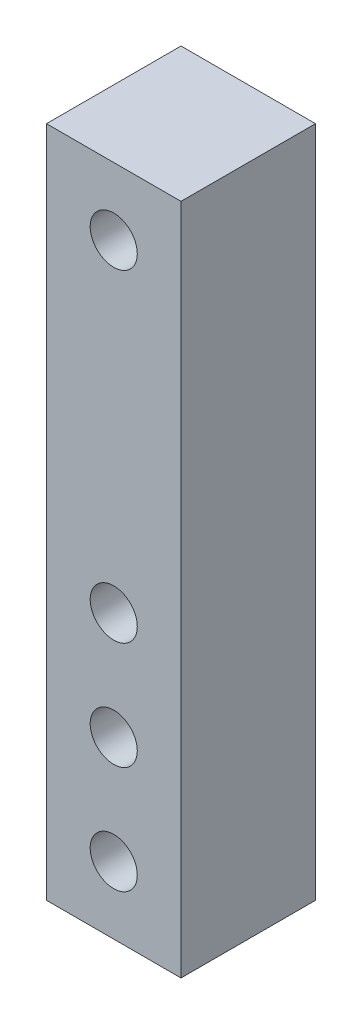
ISO-10303-21;
HEADER;
FILE_DESCRIPTION(('STEP AP214'),'2;1');
FILE_NAME('part.step','',(''),(''),'','','');
FILE_SCHEMA(('AUTOMOTIVE_DESIGN { 1 0 10303 214 1 1 1 1 }'));
ENDSEC;
DATA;
#1=APPLICATION_CONTEXT('core data for automotive mechanical design processes');
#2=APPLICATION_PROTOCOL_DEFINITION('international standard','automotive_design',2000,#1);
#3=PRODUCT_CONTEXT('',#1,'mechanical');
#4=PRODUCT('Part','Part','',(#3));
#5=PRODUCT_RELATED_PRODUCT_CATEGORY('part','',(#4));
#6=PRODUCT_DEFINITION_FORMATION('','',#4);
#7=PRODUCT_DEFINITION_CONTEXT('part definition',#1,'design');
#8=PRODUCT_DEFINITION('design','',#6,#7);
#9=PRODUCT_DEFINITION_SHAPE('','',#8);
#10=(LENGTH_UNIT() NAMED_UNIT(*) SI_UNIT(.MILLI.,.METRE.));
#11=(NAMED_UNIT(*) PLANE_ANGLE_UNIT() SI_UNIT($,.RADIAN.));
#12=(NAMED_UNIT(*) SI_UNIT($,.STERADIAN.) SOLID_ANGLE_UNIT());
#13=UNCERTAINTY_MEASURE_WITH_UNIT(LENGTH_MEASURE(1.E-05),#10,'distance_accuracy_value','');
#14=(GEOMETRIC_REPRESENTATION_CONTEXT(3) GLOBAL_UNCERTAINTY_ASSIGNED_CONTEXT((#13)) GLOBAL_UNIT_ASSIGNED_CONTEXT((#10,
#11,#12)) REPRESENTATION_CONTEXT('',''));
#15=CARTESIAN_POINT('',(0.,0.,0.));
#16=DIRECTION('',(0.,0.,1.));
#17=DIRECTION('',(1.,0.,0.));
#18=AXIS2_PLACEMENT_3D('',#15,#16,#17);
#19=CARTESIAN_POINT('',(0.,0.,10.));
#20=DIRECTION('',(0.,0.,1.));
#21=DIRECTION('',(1.,0.,0.));
#22=AXIS2_PLACEMENT_3D('',#19,#20,#21);
#23=PLANE('',#22);
#24=CARTESIAN_POINT('',(0.,-4.,10.));
#25=DIRECTION('',(0.,0.,1.));
#26=DIRECTION('',(1.,0.,0.));
#27=AXIS2_PLACEMENT_3D('',#24,#25,#26);
#28=CIRCLE('',#27,1.75);
#29=CARTESIAN_POINT('',(1.75,-4.,10.));
#30=VERTEX_POINT('',#29);
#31=EDGE_CURVE('E146',#30,#30,#28,.T.);
#32=ORIENTED_EDGE('',*,*,#31,.F.);
#33=EDGE_LOOP('',(#32));
#34=FACE_BOUND('',#33,.T.);
#35=CARTESIAN_POINT('',(0.,-20.,10.));
#36=DIRECTION('',(0.,0.,1.));
#37=DIRECTION('',(1.,0.,0.));
#38=AXIS2_PLACEMENT_3D('',#35,#36,#37);
#39=CIRCLE('',#38,1.75);
#40=CARTESIAN_POINT('',(1.75000000000001,-20.,10.));
#41=VERTEX_POINT('',#40);
#42=EDGE_CURVE('E116',#41,#41,#39,.T.);
#43=ORIENTED_EDGE('',*,*,#42,.F.);
#44=EDGE_LOOP('',(#43));
#45=FACE_BOUND('',#44,.T.);
#46=DIRECTION('',(0.,1.,0.));
#47=VECTOR('',#46,1.);
#48=CARTESIAN_POINT('',(5.,25.,10.));
#49=LINE('',#48,#47);
#50=CARTESIAN_POINT('',(5.,-25.,10.));
#51=VERTEX_POINT('',#50);
#52=CARTESIAN_POINT('',(5.,25.,10.));
#53=VERTEX_POINT('',#52);
#54=EDGE_CURVE('E96',#51,#53,#49,.T.);
#55=ORIENTED_EDGE('',*,*,#54,.T.);
#56=DIRECTION('',(-1.,0.,0.));
#57=VECTOR('',#56,1.);
#58=CARTESIAN_POINT('',(-5.,25.,10.));
#59=LINE('',#58,#57);
#60=CARTESIAN_POINT('',(-5.,25.,10.));
#61=VERTEX_POINT('',#60);
#62=EDGE_CURVE('E91',#53,#61,#59,.T.);
#63=ORIENTED_EDGE('',*,*,#62,.T.);
#64=DIRECTION('',(0.,-1.,0.));
#65=VECTOR('',#64,1.);
#66=CARTESIAN_POINT('',(-5.,25.,10.));
#67=LINE('',#66,#65);
#68=CARTESIAN_POINT('',(-5.,-25.,10.));
#69=VERTEX_POINT('',#68);
#70=EDGE_CURVE('E94',#61,#69,#67,.T.);
#71=ORIENTED_EDGE('',*,*,#70,.T.);
#72=DIRECTION('',(1.,0.,0.));
#73=VECTOR('',#72,1.);
#74=CARTESIAN_POINT('',(-5.,-25.,10.));
#75=LINE('',#74,#73);
#76=EDGE_CURVE('E61',#69,#51,#75,.T.);
#77=ORIENTED_EDGE('',*,*,#76,.T.);
#78=EDGE_LOOP('',(#55,#63,#71,#77));
#79=FACE_BOUND('',#78,.T.);
#80=CARTESIAN_POINT('',(0.,-12.,10.));
#81=DIRECTION('',(0.,0.,1.));
#82=DIRECTION('',(1.,0.,0.));
#83=AXIS2_PLACEMENT_3D('',#80,#81,#82);
#84=CIRCLE('',#83,1.75);
#85=CARTESIAN_POINT('',(1.75,-12.,10.));
#86=VERTEX_POINT('',#85);
#87=EDGE_CURVE('E138',#86,#86,#84,.T.);
#88=ORIENTED_EDGE('',*,*,#87,.F.);
#89=EDGE_LOOP('',(#88));
#90=FACE_BOUND('',#89,.T.);
#91=CARTESIAN_POINT('',(0.,20.,10.));
#92=DIRECTION('',(0.,0.,1.));
#93=DIRECTION('',(1.,0.,0.));
#94=AXIS2_PLACEMENT_3D('',#91,#92,#93);
#95=CIRCLE('',#94,1.75);
#96=CARTESIAN_POINT('',(1.75,20.,10.));
#97=VERTEX_POINT('',#96);
#98=EDGE_CURVE('E154',#97,#97,#95,.T.);
#99=ORIENTED_EDGE('',*,*,#98,.F.);
#100=EDGE_LOOP('',(#99));
#101=FACE_BOUND('',#100,.T.);
#102=ADVANCED_FACE('F43',(#34,#45,#79,#90,#101),#23,.T.);
#103=CARTESIAN_POINT('',(0.,0.,0.));
#104=DIRECTION('',(0.,0.,1.));
#105=DIRECTION('',(1.,0.,0.));
#106=AXIS2_PLACEMENT_3D('',#103,#104,#105);
#107=PLANE('',#106);
#108=DIRECTION('',(0.,1.,0.));
#109=VECTOR('',#108,1.);
#110=CARTESIAN_POINT('',(5.,25.,0.));
#111=LINE('',#110,#109);
#112=CARTESIAN_POINT('',(5.,-25.,0.));
#113=VERTEX_POINT('',#112);
#114=CARTESIAN_POINT('',(5.,25.,0.));
#115=VERTEX_POINT('',#114);
#116=EDGE_CURVE('E112',#113,#115,#111,.T.);
#117=ORIENTED_EDGE('',*,*,#116,.F.);
#118=DIRECTION('',(1.,0.,0.));
#119=VECTOR('',#118,1.);
#120=CARTESIAN_POINT('',(-5.,-25.,0.));
#121=LINE('',#120,#119);
#122=CARTESIAN_POINT('',(-5.,-25.,0.));
#123=VERTEX_POINT('',#122);
#124=EDGE_CURVE('E84',#123,#113,#121,.T.);
#125=ORIENTED_EDGE('',*,*,#124,.F.);
#126=DIRECTION('',(0.,-1.,0.));
#127=VECTOR('',#126,1.);
#128=CARTESIAN_POINT('',(-5.,25.,0.));
#129=LINE('',#128,#127);
#130=CARTESIAN_POINT('',(-5.,25.,0.));
#131=VERTEX_POINT('',#130);
#132=EDGE_CURVE('E78',#131,#123,#129,.T.);
#133=ORIENTED_EDGE('',*,*,#132,.F.);
#134=DIRECTION('',(-1.,0.,0.));
#135=VECTOR('',#134,1.);
#136=CARTESIAN_POINT('',(-5.,25.,0.));
#137=LINE('',#136,#135);
#138=EDGE_CURVE('E101',#115,#131,#137,.T.);
#139=ORIENTED_EDGE('',*,*,#138,.F.);
#140=EDGE_LOOP('',(#117,#125,#133,#139));
#141=FACE_BOUND('',#140,.T.);
#142=CARTESIAN_POINT('',(0.,-20.,0.));
#143=DIRECTION('',(0.,0.,1.));
#144=DIRECTION('',(1.,0.,0.));
#145=AXIS2_PLACEMENT_3D('',#142,#143,#144);
#146=CIRCLE('',#145,1.75);
#147=CARTESIAN_POINT('',(1.75000000000001,-20.,0.));
#148=VERTEX_POINT('',#147);
#149=EDGE_CURVE('E134',#148,#148,#146,.T.);
#150=ORIENTED_EDGE('',*,*,#149,.T.);
#151=EDGE_LOOP('',(#150));
#152=FACE_BOUND('',#151,.T.);
#153=CARTESIAN_POINT('',(0.,-12.,0.));
#154=DIRECTION('',(0.,0.,1.));
#155=DIRECTION('',(1.,0.,0.));
#156=AXIS2_PLACEMENT_3D('',#153,#154,#155);
#157=CIRCLE('',#156,1.75);
#158=CARTESIAN_POINT('',(1.75,-12.,0.));
#159=VERTEX_POINT('',#158);
#160=EDGE_CURVE('E142',#159,#159,#157,.T.);
#161=ORIENTED_EDGE('',*,*,#160,.T.);
#162=EDGE_LOOP('',(#161));
#163=FACE_BOUND('',#162,.T.);
#164=CARTESIAN_POINT('',(0.,-4.,0.));
#165=DIRECTION('',(0.,0.,1.));
#166=DIRECTION('',(1.,0.,0.));
#167=AXIS2_PLACEMENT_3D('',#164,#165,#166);
#168=CIRCLE('',#167,1.75);
#169=CARTESIAN_POINT('',(1.75,-4.,0.));
#170=VERTEX_POINT('',#169);
#171=EDGE_CURVE('E150',#170,#170,#168,.T.);
#172=ORIENTED_EDGE('',*,*,#171,.T.);
#173=EDGE_LOOP('',(#172));
#174=FACE_BOUND('',#173,.T.);
#175=CARTESIAN_POINT('',(0.,20.,0.));
#176=DIRECTION('',(0.,0.,1.));
#177=DIRECTION('',(1.,0.,0.));
#178=AXIS2_PLACEMENT_3D('',#175,#176,#177);
#179=CIRCLE('',#178,1.75);
#180=CARTESIAN_POINT('',(1.75,20.,0.));
#181=VERTEX_POINT('',#180);
#182=EDGE_CURVE('E158',#181,#181,#179,.T.);
#183=ORIENTED_EDGE('',*,*,#182,.T.);
#184=EDGE_LOOP('',(#183));
#185=FACE_BOUND('',#184,.T.);
#186=ADVANCED_FACE('F129',(#141,#152,#163,#174,#185),#107,.F.);
#187=CARTESIAN_POINT('',(5.,25.,10.));
#188=DIRECTION('',(-1.,0.,0.));
#189=DIRECTION('',(0.,-1.,0.));
#190=AXIS2_PLACEMENT_3D('',#187,#188,#189);
#191=PLANE('',#190);
#192=ORIENTED_EDGE('',*,*,#116,.T.);
#193=DIRECTION('',(0.,0.,-1.));
#194=VECTOR('',#193,1.);
#195=CARTESIAN_POINT('',(5.,25.,10.));
#196=LINE('',#195,#194);
#197=EDGE_CURVE('E11',#53,#115,#196,.T.);
#198=ORIENTED_EDGE('',*,*,#197,.F.);
#199=ORIENTED_EDGE('',*,*,#54,.F.);
#200=DIRECTION('',(0.,0.,-1.));
#201=VECTOR('',#200,1.);
#202=CARTESIAN_POINT('',(5.,-25.,10.));
#203=LINE('',#202,#201);
#204=EDGE_CURVE('E108',#51,#113,#203,.T.);
#205=ORIENTED_EDGE('',*,*,#204,.T.);
#206=EDGE_LOOP('',(#192,#198,#199,#205));
#207=FACE_BOUND('',#206,.T.);
#208=ADVANCED_FACE('F45',(#207),#191,.F.);
#209=CARTESIAN_POINT('',(-5.,25.,10.));
#210=DIRECTION('',(0.,-1.,0.));
#211=DIRECTION('',(0.,0.,-1.));
#212=AXIS2_PLACEMENT_3D('',#209,#210,#211);
#213=PLANE('',#212);
#214=ORIENTED_EDGE('',*,*,#138,.T.);
#215=DIRECTION('',(0.,0.,-1.));
#216=VECTOR('',#215,1.);
#217=CARTESIAN_POINT('',(-5.,25.,10.));
#218=LINE('',#217,#216);
#219=EDGE_CURVE('E53',#61,#131,#218,.T.);
#220=ORIENTED_EDGE('',*,*,#219,.F.);
#221=ORIENTED_EDGE('',*,*,#62,.F.);
#222=ORIENTED_EDGE('',*,*,#197,.T.);
#223=EDGE_LOOP('',(#214,#220,#221,#222));
#224=FACE_BOUND('',#223,.T.);
#225=ADVANCED_FACE('F100',(#224),#213,.F.);
#226=CARTESIAN_POINT('',(-5.,25.,10.));
#227=DIRECTION('',(1.,0.,0.));
#228=DIRECTION('',(0.,1.,0.));
#229=AXIS2_PLACEMENT_3D('',#226,#227,#228);
#230=PLANE('',#229);
#231=ORIENTED_EDGE('',*,*,#132,.T.);
#232=DIRECTION('',(0.,0.,-1.));
#233=VECTOR('',#232,1.);
#234=CARTESIAN_POINT('',(-5.,-25.,10.));
#235=LINE('',#234,#233);
#236=EDGE_CURVE('E103',#69,#123,#235,.T.);
#237=ORIENTED_EDGE('',*,*,#236,.F.);
#238=ORIENTED_EDGE('',*,*,#70,.F.);
#239=ORIENTED_EDGE('',*,*,#219,.T.);
#240=EDGE_LOOP('',(#231,#237,#238,#239));
#241=FACE_BOUND('',#240,.T.);
#242=ADVANCED_FACE('F104',(#241),#230,.F.);
#243=CARTESIAN_POINT('',(-5.,-25.,10.));
#244=DIRECTION('',(0.,1.,0.));
#245=DIRECTION('',(0.,0.,1.));
#246=AXIS2_PLACEMENT_3D('',#243,#244,#245);
#247=PLANE('',#246);
#248=ORIENTED_EDGE('',*,*,#124,.T.);
#249=ORIENTED_EDGE('',*,*,#204,.F.);
#250=ORIENTED_EDGE('',*,*,#76,.F.);
#251=ORIENTED_EDGE('',*,*,#236,.T.);
#252=EDGE_LOOP('',(#248,#249,#250,#251));
#253=FACE_BOUND('',#252,.T.);
#254=ADVANCED_FACE('F126',(#253),#247,.F.);
#255=CARTESIAN_POINT('',(0.,-20.,10.));
#256=DIRECTION('',(0.,0.,-1.));
#257=DIRECTION('',(-1.,0.,0.));
#258=AXIS2_PLACEMENT_3D('',#255,#256,#257);
#259=CYLINDRICAL_SURFACE('',#258,1.75);
#260=ORIENTED_EDGE('',*,*,#42,.T.);
#261=EDGE_LOOP('',(#260));
#262=FACE_BOUND('',#261,.T.);
#263=ORIENTED_EDGE('',*,*,#149,.F.);
#264=EDGE_LOOP('',(#263));
#265=FACE_BOUND('',#264,.T.);
#266=ADVANCED_FACE('F179',(#262,#265),#259,.F.);
#267=CARTESIAN_POINT('',(0.,-12.,10.));
#268=DIRECTION('',(0.,0.,-1.));
#269=DIRECTION('',(-1.,0.,0.));
#270=AXIS2_PLACEMENT_3D('',#267,#268,#269);
#271=CYLINDRICAL_SURFACE('',#270,1.75);
#272=ORIENTED_EDGE('',*,*,#87,.T.);
#273=EDGE_LOOP('',(#272));
#274=FACE_BOUND('',#273,.T.);
#275=ORIENTED_EDGE('',*,*,#160,.F.);
#276=EDGE_LOOP('',(#275));
#277=FACE_BOUND('',#276,.T.);
#278=ADVANCED_FACE('F233',(#274,#277),#271,.F.);
#279=CARTESIAN_POINT('',(0.,-4.,10.));
#280=DIRECTION('',(0.,0.,-1.));
#281=DIRECTION('',(-1.,0.,0.));
#282=AXIS2_PLACEMENT_3D('',#279,#280,#281);
#283=CYLINDRICAL_SURFACE('',#282,1.75);
#284=ORIENTED_EDGE('',*,*,#31,.T.);
#285=EDGE_LOOP('',(#284));
#286=FACE_BOUND('',#285,.T.);
#287=ORIENTED_EDGE('',*,*,#171,.F.);
#288=EDGE_LOOP('',(#287));
#289=FACE_BOUND('',#288,.T.);
#290=ADVANCED_FACE('F242',(#286,#289),#283,.F.);
#291=CARTESIAN_POINT('',(0.,20.,10.));
#292=DIRECTION('',(0.,0.,-1.));
#293=DIRECTION('',(-1.,0.,0.));
#294=AXIS2_PLACEMENT_3D('',#291,#292,#293);
#295=CYLINDRICAL_SURFACE('',#294,1.75);
#296=ORIENTED_EDGE('',*,*,#98,.T.);
#297=EDGE_LOOP('',(#296));
#298=FACE_BOUND('',#297,.T.);
#299=ORIENTED_EDGE('',*,*,#182,.F.);
#300=EDGE_LOOP('',(#299));
#301=FACE_BOUND('',#300,.T.);
#302=ADVANCED_FACE('F166',(#298,#301),#295,.F.);
#303=CLOSED_SHELL('',(#102,#186,#208,#225,#242,#254,#266,#278,#290,#302));
#304=MANIFOLD_SOLID_BREP('B2',#303);
#305=ADVANCED_BREP_SHAPE_REPRESENTATION('',(#18,#304),#14);
#306=SHAPE_DEFINITION_REPRESENTATION(#9,#305);
ENDSEC;
END-ISO-10303-21;
